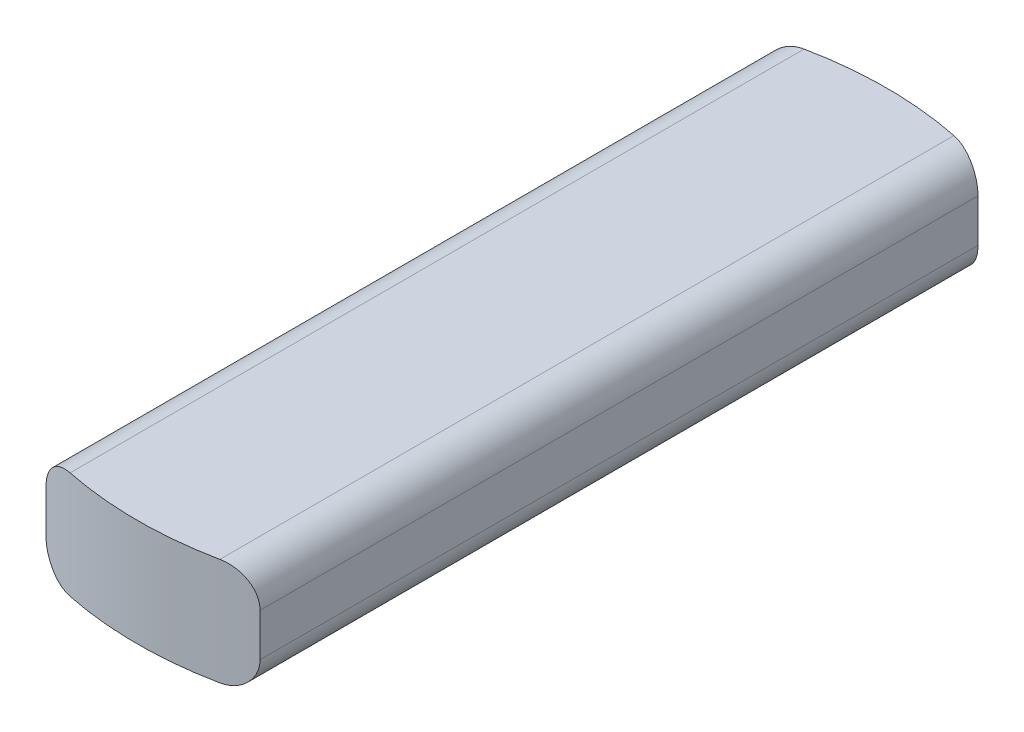
ISO-10303-21;
HEADER;
FILE_DESCRIPTION(('STEP AP214'),'2;1');
FILE_NAME('part.step','',(''),(''),'','','');
FILE_SCHEMA(('AUTOMOTIVE_DESIGN { 1 0 10303 214 1 1 1 1 }'));
ENDSEC;
DATA;
#1=APPLICATION_CONTEXT('core data for automotive mechanical design processes');
#2=APPLICATION_PROTOCOL_DEFINITION('international standard','automotive_design',2000,#1);
#3=PRODUCT_CONTEXT('',#1,'mechanical');
#4=PRODUCT('Part','Part','',(#3));
#5=PRODUCT_RELATED_PRODUCT_CATEGORY('part','',(#4));
#6=PRODUCT_DEFINITION_FORMATION('','',#4);
#7=PRODUCT_DEFINITION_CONTEXT('part definition',#1,'design');
#8=PRODUCT_DEFINITION('design','',#6,#7);
#9=PRODUCT_DEFINITION_SHAPE('','',#8);
#10=(LENGTH_UNIT() NAMED_UNIT(*) SI_UNIT(.MILLI.,.METRE.));
#11=(NAMED_UNIT(*) PLANE_ANGLE_UNIT() SI_UNIT($,.RADIAN.));
#12=(NAMED_UNIT(*) SI_UNIT($,.STERADIAN.) SOLID_ANGLE_UNIT());
#13=UNCERTAINTY_MEASURE_WITH_UNIT(LENGTH_MEASURE(1.E-05),#10,'distance_accuracy_value','');
#14=(GEOMETRIC_REPRESENTATION_CONTEXT(3) GLOBAL_UNCERTAINTY_ASSIGNED_CONTEXT((#13)) GLOBAL_UNIT_ASSIGNED_CONTEXT((#10,
#11,#12)) REPRESENTATION_CONTEXT('',''));
#15=CARTESIAN_POINT('',(0.,0.,0.));
#16=DIRECTION('',(0.,0.,1.));
#17=DIRECTION('',(1.,0.,0.));
#18=AXIS2_PLACEMENT_3D('',#15,#16,#17);
#19=CARTESIAN_POINT('',(-3.5,-1.,17.5));
#20=DIRECTION('',(0.,0.,-1.));
#21=DIRECTION('',(-1.,0.,0.));
#22=AXIS2_PLACEMENT_3D('',#19,#20,#21);
#23=CYLINDRICAL_SURFACE('',#22,1.5);
#24=CARTESIAN_POINT('',(-5.,-0.99999999999999,16.7705098312484));
#25=CARTESIAN_POINT('',(-5.00000065870343,-1.04104128220143,16.7705087352578));
#26=CARTESIAN_POINT('',(-4.998314497937,-1.08206230306019,16.7710124468364));
#27=CARTESIAN_POINT('',(-4.9915939494939,-1.16379838036076,16.7730142824674));
#28=CARTESIAN_POINT('',(-4.98656008171913,-1.20451348331913,16.7745122521104));
#29=CARTESIAN_POINT('',(-4.96651401385506,-1.32558078689147,16.780463179868));
#30=CARTESIAN_POINT('',(-4.94655699573606,-1.40510186332665,16.7863733472426));
#31=CARTESIAN_POINT('',(-4.89414164424874,-1.55948677231694,16.8017294613077));
#32=CARTESIAN_POINT('',(-4.86168375279418,-1.6343507693941,16.8111752830103));
#33=CARTESIAN_POINT('',(-4.78531529286935,-1.77752601402684,16.8330725078136));
#34=CARTESIAN_POINT('',(-4.74140205432498,-1.84583572879082,16.8455246115843));
#35=CARTESIAN_POINT('',(-4.64241461631817,-1.97554314239626,16.8730753815252));
#36=CARTESIAN_POINT('',(-4.58712661375274,-2.03676683410889,16.8882238579813));
#37=CARTESIAN_POINT('',(-4.46755173064513,-2.14916475273037,16.9202484541548));
#38=CARTESIAN_POINT('',(-4.40326216392505,-2.20033596886261,16.9371250891706));
#39=CARTESIAN_POINT('',(-4.26489872919042,-2.29310508933865,16.9725047058644));
#40=CARTESIAN_POINT('',(-4.19055211852855,-2.33428207337126,16.9910446625764));
#41=CARTESIAN_POINT('',(-4.03605696698123,-2.40349625128991,17.0284042303154));
#42=CARTESIAN_POINT('',(-3.9559105508048,-2.43153822922082,17.0472237369437));
#43=CARTESIAN_POINT('',(-3.81300166947133,-2.46833096854783,17.0796640213863));
#44=CARTESIAN_POINT('',(-3.75104101082652,-2.48018244353934,17.0933823894182));
#45=CARTESIAN_POINT('',(-3.62608733313874,-2.49601886003614,17.1203279805614));
#46=CARTESIAN_POINT('',(-3.56309545768596,-2.50001198962522,17.1335557007881));
#47=CARTESIAN_POINT('',(-3.49999999999999,-2.5,17.1464281994823));
#48=B_SPLINE_CURVE_WITH_KNOTS('',3,(#24,#25,#26,#27,#28,#29,#30,#31,#32,#33,#34,#35,#36,#37,#38,
#39,#40,#41,#42,#43,#44,#45,#46,#47),.UNSPECIFIED.,.F.,.F.,(4,2,2,2,2,2,2,2,2,2,2,4),(0.,
0.123046220415898,0.246073336104379,0.491396587958453,0.73671116827691,0.982082979011625,
1.23257571423747,1.48314335953641,1.74291920001327,2.00260035096508,2.19580727296565,
2.38881277421535),.UNSPECIFIED.);
#49=CARTESIAN_POINT('',(-5.,-0.99999999999999,16.7705098312484));
#50=VERTEX_POINT('',#49);
#51=CARTESIAN_POINT('',(-3.49999999999999,-2.5,17.1464281994823));
#52=VERTEX_POINT('',#51);
#53=EDGE_CURVE('E155',#50,#52,#48,.T.);
#54=ORIENTED_EDGE('',*,*,#53,.F.);
#55=DIRECTION('',(0.,0.,-1.));
#56=VECTOR('',#55,1.);
#57=CARTESIAN_POINT('',(-5.,-0.99999999999999,17.5));
#58=LINE('',#57,#56);
#59=CARTESIAN_POINT('',(-5.,-0.99999999999999,-16.7705098312484));
#60=VERTEX_POINT('',#59);
#61=EDGE_CURVE('E221',#50,#60,#58,.T.);
#62=ORIENTED_EDGE('',*,*,#61,.T.);
#63=CARTESIAN_POINT('',(-3.49999999999999,-2.5,-17.1464281994823));
#64=CARTESIAN_POINT('',(-3.54324647271187,-2.49999932347869,-17.137601506285));
#65=CARTESIAN_POINT('',(-3.58643723406876,-2.49812872026213,-17.1286136308124));
#66=CARTESIAN_POINT('',(-3.6724389631635,-2.49068092810015,-17.110380460051));
#67=CARTESIAN_POINT('',(-3.71524996722869,-2.48510409765068,-17.1011351897422));
#68=CARTESIAN_POINT('',(-3.84259775178756,-2.46288553774404,-17.0731357012091));
#69=CARTESIAN_POINT('',(-3.92617876783643,-2.44075552597619,-17.0540913202089));
#70=CARTESIAN_POINT('',(-4.08828308477007,-2.38251689366131,-17.0159600625531));
#71=CARTESIAN_POINT('',(-4.16680510086307,-2.34640473838125,-16.9968731763662));
#72=CARTESIAN_POINT('',(-4.31663684751532,-2.26116117394723,-16.9594401207682));
#73=CARTESIAN_POINT('',(-4.38794733376356,-2.21203113088194,-16.9410938738676));
#74=CARTESIAN_POINT('',(-4.52127649962827,-2.10202685320372,-16.9059995121423));
#75=CARTESIAN_POINT('',(-4.58329779878109,-2.04115594061732,-16.8892509472594));
#76=CARTESIAN_POINT('',(-4.69616925346195,-1.90923631660742,-16.8582154943923));
#77=CARTESIAN_POINT('',(-4.7470185270035,-1.83818680235523,-16.8439288007821));
#78=CARTESIAN_POINT('',(-4.83471052114633,-1.68977903608785,-16.8189657470596));
#79=CARTESIAN_POINT('',(-4.87186994605262,-1.61262146691293,-16.8082084818945));
#80=CARTESIAN_POINT('',(-4.932584363315,-1.45275924765054,-16.7904920237656));
#81=CARTESIAN_POINT('',(-4.95615501863049,-1.37006110712238,-16.7835284585433));
#82=CARTESIAN_POINT('',(-4.98163949538542,-1.23885376627147,-16.7759754861866));
#83=CARTESIAN_POINT('',(-4.98851965575464,-1.19133806094454,-16.7739294315573));
#84=CARTESIAN_POINT('',(-4.99769869833015,-1.09588997391677,-16.7711960417626));
#85=CARTESIAN_POINT('',(-5.00000350413977,-1.04795821177911,-16.7705069497792));
#86=CARTESIAN_POINT('',(-5.,-0.99999999999999,-16.7705098312484));
#87=B_SPLINE_CURVE_WITH_KNOTS('',3,(#63,#64,#65,#66,#67,#68,#69,#70,#71,#72,#73,#74,#75,#76,#77,
#78,#79,#80,#81,#82,#83,#84,#85,#86),.UNSPECIFIED.,.F.,.F.,(4,2,2,2,2,2,2,2,2,2,2,4),(0.,
0.132330565333009,0.26464833245755,0.52889249280884,0.793203498637663,1.05748677881919,
1.32169539063307,1.58592485316529,1.84358724598466,2.10095204995877,2.24490138297897,
2.38866422633939),.UNSPECIFIED.);
#88=CARTESIAN_POINT('',(-3.49999999999999,-2.5,-17.1464281994823));
#89=VERTEX_POINT('',#88);
#90=EDGE_CURVE('E56',#89,#60,#87,.T.);
#91=ORIENTED_EDGE('',*,*,#90,.F.);
#92=DIRECTION('',(0.,0.,-1.));
#93=VECTOR('',#92,1.);
#94=CARTESIAN_POINT('',(-3.49999999999999,-2.5,17.5));
#95=LINE('',#94,#93);
#96=EDGE_CURVE('E12',#52,#89,#95,.T.);
#97=ORIENTED_EDGE('',*,*,#96,.F.);
#98=EDGE_LOOP('',(#54,#62,#91,#97));
#99=FACE_BOUND('',#98,.T.);
#100=ADVANCED_FACE('F33',(#99),#23,.T.);
#101=CARTESIAN_POINT('',(-3.49999999999999,-2.5,17.5));
#102=DIRECTION('',(0.,1.,0.));
#103=DIRECTION('',(0.,0.,1.));
#104=AXIS2_PLACEMENT_3D('',#101,#102,#103);
#105=PLANE('',#104);
#106=CARTESIAN_POINT('',(0.,-2.5,0.));
#107=DIRECTION('',(0.,1.,0.));
#108=DIRECTION('',(0.,0.,1.));
#109=AXIS2_PLACEMENT_3D('',#106,#107,#108);
#110=CIRCLE('',#109,17.5);
#111=CARTESIAN_POINT('',(3.5,-2.5,-17.1464281994823));
#112=VERTEX_POINT('',#111);
#113=EDGE_CURVE('E115',#112,#89,#110,.T.);
#114=ORIENTED_EDGE('',*,*,#113,.F.);
#115=DIRECTION('',(0.,0.,-1.));
#116=VECTOR('',#115,1.);
#117=CARTESIAN_POINT('',(3.49999999999999,-2.5,17.5));
#118=LINE('',#117,#116);
#119=CARTESIAN_POINT('',(3.5,-2.5,17.1464281994823));
#120=VERTEX_POINT('',#119);
#121=EDGE_CURVE('E41',#120,#112,#118,.T.);
#122=ORIENTED_EDGE('',*,*,#121,.F.);
#123=EDGE_CURVE('E141',#52,#120,#110,.T.);
#124=ORIENTED_EDGE('',*,*,#123,.F.);
#125=ORIENTED_EDGE('',*,*,#96,.T.);
#126=EDGE_LOOP('',(#114,#122,#124,#125));
#127=FACE_BOUND('',#126,.T.);
#128=ADVANCED_FACE('F140',(#127),#105,.F.);
#129=CARTESIAN_POINT('',(3.5,-1.,17.5));
#130=DIRECTION('',(0.,0.,-1.));
#131=DIRECTION('',(-1.,0.,0.));
#132=AXIS2_PLACEMENT_3D('',#129,#130,#131);
#133=CYLINDRICAL_SURFACE('',#132,1.5);
#134=CARTESIAN_POINT('',(3.49999999999999,-2.5,17.1464281994823));
#135=CARTESIAN_POINT('',(3.54324647271187,-2.49999932347869,17.137601506285));
#136=CARTESIAN_POINT('',(3.58643723406876,-2.49812872026213,17.1286136308124));
#137=CARTESIAN_POINT('',(3.6724389631635,-2.49068092810015,17.110380460051));
#138=CARTESIAN_POINT('',(3.71524996722869,-2.48510409765068,17.1011351897422));
#139=CARTESIAN_POINT('',(3.84259775178756,-2.46288553774404,17.0731357012091));
#140=CARTESIAN_POINT('',(3.92617876783643,-2.44075552597618,17.0540913202089));
#141=CARTESIAN_POINT('',(4.08828308477007,-2.38251689366131,17.0159600625531));
#142=CARTESIAN_POINT('',(4.16680510086307,-2.34640473838125,16.9968731763662));
#143=CARTESIAN_POINT('',(4.31663684751532,-2.26116117394723,16.9594401207682));
#144=CARTESIAN_POINT('',(4.38794733376355,-2.21203113088194,16.9410938738676));
#145=CARTESIAN_POINT('',(4.52127649962827,-2.10202685320372,16.9059995121423));
#146=CARTESIAN_POINT('',(4.58329779878109,-2.04115594061732,16.8892509472594));
#147=CARTESIAN_POINT('',(4.69616925346195,-1.90923631660742,16.8582154943923));
#148=CARTESIAN_POINT('',(4.7470185270035,-1.83818680235523,16.8439288007821));
#149=CARTESIAN_POINT('',(4.83471052114633,-1.68977903608785,16.8189657470596));
#150=CARTESIAN_POINT('',(4.87186994605262,-1.61262146691292,16.8082084818945));
#151=CARTESIAN_POINT('',(4.93258436331499,-1.45275924765054,16.7904920237656));
#152=CARTESIAN_POINT('',(4.95615501863049,-1.37006110712238,16.7835284585433));
#153=CARTESIAN_POINT('',(4.98163949538542,-1.23885376627147,16.7759754861866));
#154=CARTESIAN_POINT('',(4.98851965575463,-1.19133806094455,16.7739294315573));
#155=CARTESIAN_POINT('',(4.99769869833015,-1.09588997391678,16.7711960417626));
#156=CARTESIAN_POINT('',(5.00000350413977,-1.04795821177912,16.7705069497792));
#157=CARTESIAN_POINT('',(5.,-1.,16.7705098312484));
#158=B_SPLINE_CURVE_WITH_KNOTS('',3,(#134,#135,#136,#137,#138,#139,#140,#141,#142,#143,#144,
#145,#146,#147,#148,#149,#150,#151,#152,#153,#154,#155,#156,#157),.UNSPECIFIED.,.F.,.F.,(4,2,2,
2,2,2,2,2,2,2,2,4),(0.,0.13233056533301,0.26464833245755,0.52889249280884,0.793203498637662,
1.05748677881919,1.32169539063307,1.58592485316529,1.84358724598467,2.10095204995878,
2.24490138297896,2.38866422633937),.UNSPECIFIED.);
#159=CARTESIAN_POINT('',(5.,-1.,16.7705098312484));
#160=VERTEX_POINT('',#159);
#161=EDGE_CURVE('E137',#120,#160,#158,.T.);
#162=ORIENTED_EDGE('',*,*,#161,.F.);
#163=ORIENTED_EDGE('',*,*,#121,.T.);
#164=CARTESIAN_POINT('',(5.,-1.,-16.7705098312484));
#165=CARTESIAN_POINT('',(5.00000065870343,-1.04104128220144,-16.7705087352578));
#166=CARTESIAN_POINT('',(4.998314497937,-1.0820623030602,-16.7710124468364));
#167=CARTESIAN_POINT('',(4.9915939494939,-1.16379838036077,-16.7730142824674));
#168=CARTESIAN_POINT('',(4.98656008171912,-1.20451348331914,-16.7745122521104));
#169=CARTESIAN_POINT('',(4.96651401385506,-1.32558078689148,-16.780463179868));
#170=CARTESIAN_POINT('',(4.94655699573606,-1.40510186332666,-16.7863733472426));
#171=CARTESIAN_POINT('',(4.89414164424874,-1.55948677231695,-16.8017294613077));
#172=CARTESIAN_POINT('',(4.86168375279417,-1.63435076939411,-16.8111752830103));
#173=CARTESIAN_POINT('',(4.78531529286935,-1.77752601402685,-16.8330725078136));
#174=CARTESIAN_POINT('',(4.74140205432497,-1.84583572879083,-16.8455246115843));
#175=CARTESIAN_POINT('',(4.64241461631816,-1.97554314239627,-16.8730753815252));
#176=CARTESIAN_POINT('',(4.58712661375273,-2.03676683410889,-16.8882238579813));
#177=CARTESIAN_POINT('',(4.46755173064512,-2.14916475273038,-16.9202484541548));
#178=CARTESIAN_POINT('',(4.40326216392504,-2.20033596886262,-16.9371250891706));
#179=CARTESIAN_POINT('',(4.26489872919041,-2.29310508933866,-16.9725047058644));
#180=CARTESIAN_POINT('',(4.19055211852854,-2.33428207337126,-16.9910446625764));
#181=CARTESIAN_POINT('',(4.03605696698122,-2.40349625128992,-17.0284042303154));
#182=CARTESIAN_POINT('',(3.95591055080479,-2.43153822922083,-17.0472237369437));
#183=CARTESIAN_POINT('',(3.81300166947132,-2.46833096854783,-17.0796640213863));
#184=CARTESIAN_POINT('',(3.75104101082651,-2.48018244353934,-17.0933823894182));
#185=CARTESIAN_POINT('',(3.62608733313873,-2.49601886003614,-17.1203279805614));
#186=CARTESIAN_POINT('',(3.56309545768596,-2.50001198962522,-17.1335557007881));
#187=CARTESIAN_POINT('',(3.49999999999999,-2.5,-17.1464281994823));
#188=B_SPLINE_CURVE_WITH_KNOTS('',3,(#164,#165,#166,#167,#168,#169,#170,#171,#172,#173,#174,
#175,#176,#177,#178,#179,#180,#181,#182,#183,#184,#185,#186,#187),.UNSPECIFIED.,.F.,.F.,(4,2,2,
2,2,2,2,2,2,2,2,4),(0.,0.123046220415898,0.246073336104379,0.491396587958453,0.73671116827691,
0.982082979011626,1.23257571423747,1.48314335953641,1.74291920001327,2.00260035096508,
2.19580727296565,2.38881277421534),.UNSPECIFIED.);
#189=CARTESIAN_POINT('',(5.,-1.,-16.7705098312484));
#190=VERTEX_POINT('',#189);
#191=EDGE_CURVE('E106',#190,#112,#188,.T.);
#192=ORIENTED_EDGE('',*,*,#191,.F.);
#193=DIRECTION('',(0.,0.,-1.));
#194=VECTOR('',#193,1.);
#195=CARTESIAN_POINT('',(5.,-1.,17.5));
#196=LINE('',#195,#194);
#197=EDGE_CURVE('E123',#160,#190,#196,.T.);
#198=ORIENTED_EDGE('',*,*,#197,.F.);
#199=EDGE_LOOP('',(#162,#163,#192,#198));
#200=FACE_BOUND('',#199,.T.);
#201=ADVANCED_FACE('F135',(#200),#133,.T.);
#202=CARTESIAN_POINT('',(5.,-0.99999999999999,17.5));
#203=DIRECTION('',(-1.,0.,0.));
#204=DIRECTION('',(0.,0.,1.));
#205=AXIS2_PLACEMENT_3D('',#202,#203,#204);
#206=PLANE('',#205);
#207=DIRECTION('',(0.,1.,0.));
#208=VECTOR('',#207,1.);
#209=CARTESIAN_POINT('',(5.,-2.5,16.7705098312484));
#210=LINE('',#209,#208);
#211=CARTESIAN_POINT('',(5.,0.999999999999989,16.7705098312484));
#212=VERTEX_POINT('',#211);
#213=EDGE_CURVE('E101',#160,#212,#210,.T.);
#214=ORIENTED_EDGE('',*,*,#213,.F.);
#215=ORIENTED_EDGE('',*,*,#197,.T.);
#216=DIRECTION('',(0.,1.,0.));
#217=VECTOR('',#216,1.);
#218=CARTESIAN_POINT('',(5.,-2.5,-16.7705098312484));
#219=LINE('',#218,#217);
#220=CARTESIAN_POINT('',(5.,0.999999999999989,-16.7705098312484));
#221=VERTEX_POINT('',#220);
#222=EDGE_CURVE('E300',#221,#190,#219,.F.);
#223=ORIENTED_EDGE('',*,*,#222,.F.);
#224=DIRECTION('',(0.,0.,-1.));
#225=VECTOR('',#224,1.);
#226=CARTESIAN_POINT('',(5.,0.999999999999989,17.5));
#227=LINE('',#226,#225);
#228=EDGE_CURVE('E121',#212,#221,#227,.T.);
#229=ORIENTED_EDGE('',*,*,#228,.F.);
#230=EDGE_LOOP('',(#214,#215,#223,#229));
#231=FACE_BOUND('',#230,.T.);
#232=ADVANCED_FACE('F209',(#231),#206,.F.);
#233=CARTESIAN_POINT('',(3.5,1.,17.5));
#234=DIRECTION('',(0.,0.,-1.));
#235=DIRECTION('',(-1.,0.,0.));
#236=AXIS2_PLACEMENT_3D('',#233,#234,#235);
#237=CYLINDRICAL_SURFACE('',#236,1.5);
#238=CARTESIAN_POINT('',(5.,0.999999999999989,16.7705098312484));
#239=CARTESIAN_POINT('',(5.00000065870343,1.04104128220143,16.7705087352578));
#240=CARTESIAN_POINT('',(4.998314497937,1.08206230306019,16.7710124468364));
#241=CARTESIAN_POINT('',(4.9915939494939,1.16379838036076,16.7730142824674));
#242=CARTESIAN_POINT('',(4.98656008171913,1.20451348331913,16.7745122521104));
#243=CARTESIAN_POINT('',(4.96651401385506,1.32558078689147,16.780463179868));
#244=CARTESIAN_POINT('',(4.94655699573606,1.40510186332665,16.7863733472426));
#245=CARTESIAN_POINT('',(4.89414164424874,1.55948677231694,16.8017294613077));
#246=CARTESIAN_POINT('',(4.86168375279417,1.6343507693941,16.8111752830103));
#247=CARTESIAN_POINT('',(4.78531529286935,1.77752601402684,16.8330725078136));
#248=CARTESIAN_POINT('',(4.74140205432498,1.84583572879082,16.8455246115843));
#249=CARTESIAN_POINT('',(4.64241461631817,1.97554314239626,16.8730753815252));
#250=CARTESIAN_POINT('',(4.58712661375274,2.03676683410889,16.8882238579813));
#251=CARTESIAN_POINT('',(4.46755173064513,2.14916475273037,16.9202484541548));
#252=CARTESIAN_POINT('',(4.40326216392505,2.20033596886261,16.9371250891706));
#253=CARTESIAN_POINT('',(4.26489872919042,2.29310508933865,16.9725047058644));
#254=CARTESIAN_POINT('',(4.19055211852855,2.33428207337126,16.9910446625764));
#255=CARTESIAN_POINT('',(4.03605696698123,2.40349625128991,17.0284042303154));
#256=CARTESIAN_POINT('',(3.9559105508048,2.43153822922082,17.0472237369437));
#257=CARTESIAN_POINT('',(3.81300166947133,2.46833096854783,17.0796640213863));
#258=CARTESIAN_POINT('',(3.75104101082652,2.48018244353934,17.0933823894182));
#259=CARTESIAN_POINT('',(3.62608733313874,2.49601886003614,17.1203279805614));
#260=CARTESIAN_POINT('',(3.56309545768596,2.50001198962522,17.1335557007881));
#261=CARTESIAN_POINT('',(3.49999999999999,2.5,17.1464281994823));
#262=B_SPLINE_CURVE_WITH_KNOTS('',3,(#238,#239,#240,#241,#242,#243,#244,#245,#246,#247,#248,
#249,#250,#251,#252,#253,#254,#255,#256,#257,#258,#259,#260,#261),.UNSPECIFIED.,.F.,.F.,(4,2,2,
2,2,2,2,2,2,2,2,4),(0.,0.123046220415898,0.24607333610438,0.491396587958454,0.736711168276911,
0.982082979011626,1.23257571423748,1.48314335953641,1.74291920001327,2.00260035096508,
2.19580727296565,2.38881277421535),.UNSPECIFIED.);
#263=CARTESIAN_POINT('',(3.49999999999999,2.5,17.1464281994823));
#264=VERTEX_POINT('',#263);
#265=EDGE_CURVE('E96',#212,#264,#262,.T.);
#266=ORIENTED_EDGE('',*,*,#265,.F.);
#267=ORIENTED_EDGE('',*,*,#228,.T.);
#268=CARTESIAN_POINT('',(3.49999999999999,2.5,-17.1464281994823));
#269=CARTESIAN_POINT('',(3.54324647271187,2.49999932347869,-17.137601506285));
#270=CARTESIAN_POINT('',(3.58643723406876,2.49812872026213,-17.1286136308124));
#271=CARTESIAN_POINT('',(3.6724389631635,2.49068092810015,-17.110380460051));
#272=CARTESIAN_POINT('',(3.71524996722869,2.48510409765068,-17.1011351897422));
#273=CARTESIAN_POINT('',(3.84259775178756,2.46288553774404,-17.0731357012091));
#274=CARTESIAN_POINT('',(3.92617876783643,2.44075552597618,-17.0540913202089));
#275=CARTESIAN_POINT('',(4.08828308477007,2.38251689366131,-17.0159600625531));
#276=CARTESIAN_POINT('',(4.16680510086307,2.34640473838125,-16.9968731763662));
#277=CARTESIAN_POINT('',(4.31663684751532,2.26116117394723,-16.9594401207682));
#278=CARTESIAN_POINT('',(4.38794733376355,2.21203113088194,-16.9410938738676));
#279=CARTESIAN_POINT('',(4.52127649962827,2.10202685320372,-16.9059995121423));
#280=CARTESIAN_POINT('',(4.58329779878109,2.04115594061732,-16.8892509472594));
#281=CARTESIAN_POINT('',(4.69616925346194,1.90923631660742,-16.8582154943923));
#282=CARTESIAN_POINT('',(4.7470185270035,1.83818680235523,-16.8439288007821));
#283=CARTESIAN_POINT('',(4.83471052114633,1.68977903608785,-16.8189657470596));
#284=CARTESIAN_POINT('',(4.87186994605262,1.61262146691293,-16.8082084818945));
#285=CARTESIAN_POINT('',(4.93258436331499,1.45275924765054,-16.7904920237656));
#286=CARTESIAN_POINT('',(4.95615501863049,1.37006110712238,-16.7835284585433));
#287=CARTESIAN_POINT('',(4.98163949538542,1.23885376627147,-16.7759754861866));
#288=CARTESIAN_POINT('',(4.98851965575463,1.19133806094454,-16.7739294315573));
#289=CARTESIAN_POINT('',(4.99769869833015,1.09588997391677,-16.7711960417626));
#290=CARTESIAN_POINT('',(5.00000350413977,1.04795821177911,-16.7705069497792));
#291=CARTESIAN_POINT('',(5.,0.999999999999989,-16.7705098312484));
#292=B_SPLINE_CURVE_WITH_KNOTS('',3,(#268,#269,#270,#271,#272,#273,#274,#275,#276,#277,#278,
#279,#280,#281,#282,#283,#284,#285,#286,#287,#288,#289,#290,#291),.UNSPECIFIED.,.F.,.F.,(4,2,2,
2,2,2,2,2,2,2,2,4),(0.,0.13233056533301,0.26464833245755,0.52889249280884,0.793203498637663,
1.05748677881919,1.32169539063307,1.58592485316529,1.84358724598466,2.10095204995878,
2.24490138297897,2.38866422633939),.UNSPECIFIED.);
#293=CARTESIAN_POINT('',(3.49999999999999,2.5,-17.1464281994823));
#294=VERTEX_POINT('',#293);
#295=EDGE_CURVE('E120',#294,#221,#292,.T.);
#296=ORIENTED_EDGE('',*,*,#295,.F.);
#297=DIRECTION('',(0.,0.,-1.));
#298=VECTOR('',#297,1.);
#299=CARTESIAN_POINT('',(3.49999999999999,2.5,17.5));
#300=LINE('',#299,#298);
#301=EDGE_CURVE('E112',#264,#294,#300,.T.);
#302=ORIENTED_EDGE('',*,*,#301,.F.);
#303=EDGE_LOOP('',(#266,#267,#296,#302));
#304=FACE_BOUND('',#303,.T.);
#305=ADVANCED_FACE('F119',(#304),#237,.T.);
#306=CARTESIAN_POINT('',(-3.49999999999999,2.5,17.5));
#307=DIRECTION('',(0.,-1.,0.));
#308=DIRECTION('',(0.,0.,-1.));
#309=AXIS2_PLACEMENT_3D('',#306,#307,#308);
#310=PLANE('',#309);
#311=CARTESIAN_POINT('',(0.,2.5,0.));
#312=DIRECTION('',(0.,1.,0.));
#313=DIRECTION('',(0.,0.,1.));
#314=AXIS2_PLACEMENT_3D('',#311,#312,#313);
#315=CIRCLE('',#314,17.5);
#316=CARTESIAN_POINT('',(-3.5,2.5,17.1464281994823));
#317=VERTEX_POINT('',#316);
#318=EDGE_CURVE('E99',#317,#264,#315,.T.);
#319=ORIENTED_EDGE('',*,*,#318,.T.);
#320=ORIENTED_EDGE('',*,*,#301,.T.);
#321=CARTESIAN_POINT('',(-3.5,2.5,-17.1464281994823));
#322=VERTEX_POINT('',#321);
#323=EDGE_CURVE('E116',#294,#322,#315,.T.);
#324=ORIENTED_EDGE('',*,*,#323,.T.);
#325=DIRECTION('',(0.,0.,-1.));
#326=VECTOR('',#325,1.);
#327=CARTESIAN_POINT('',(-3.49999999999999,2.5,17.5));
#328=LINE('',#327,#326);
#329=EDGE_CURVE('E114',#317,#322,#328,.T.);
#330=ORIENTED_EDGE('',*,*,#329,.F.);
#331=EDGE_LOOP('',(#319,#320,#324,#330));
#332=FACE_BOUND('',#331,.T.);
#333=ADVANCED_FACE('F111',(#332),#310,.F.);
#334=CARTESIAN_POINT('',(-3.5,1.,17.5));
#335=DIRECTION('',(0.,0.,-1.));
#336=DIRECTION('',(-1.,0.,0.));
#337=AXIS2_PLACEMENT_3D('',#334,#335,#336);
#338=CYLINDRICAL_SURFACE('',#337,1.5);
#339=CARTESIAN_POINT('',(-3.49999999999999,2.5,17.1464281994823));
#340=CARTESIAN_POINT('',(-3.54324647271187,2.49999932347869,17.137601506285));
#341=CARTESIAN_POINT('',(-3.58643723406876,2.49812872026213,17.1286136308124));
#342=CARTESIAN_POINT('',(-3.6724389631635,2.49068092810015,17.110380460051));
#343=CARTESIAN_POINT('',(-3.71524996722869,2.48510409765068,17.1011351897422));
#344=CARTESIAN_POINT('',(-3.84259775178756,2.46288553774404,17.0731357012091));
#345=CARTESIAN_POINT('',(-3.92617876783643,2.44075552597618,17.0540913202089));
#346=CARTESIAN_POINT('',(-4.08828308477007,2.38251689366131,17.0159600625531));
#347=CARTESIAN_POINT('',(-4.16680510086307,2.34640473838124,16.9968731763662));
#348=CARTESIAN_POINT('',(-4.31663684751532,2.26116117394723,16.9594401207682));
#349=CARTESIAN_POINT('',(-4.38794733376356,2.21203113088194,16.9410938738676));
#350=CARTESIAN_POINT('',(-4.52127649962827,2.10202685320372,16.9059995121423));
#351=CARTESIAN_POINT('',(-4.58329779878109,2.04115594061732,16.8892509472594));
#352=CARTESIAN_POINT('',(-4.69616925346195,1.90923631660742,16.8582154943923));
#353=CARTESIAN_POINT('',(-4.7470185270035,1.83818680235523,16.8439288007821));
#354=CARTESIAN_POINT('',(-4.83471052114633,1.68977903608785,16.8189657470596));
#355=CARTESIAN_POINT('',(-4.87186994605262,1.61262146691292,16.8082084818945));
#356=CARTESIAN_POINT('',(-4.932584363315,1.45275924765054,16.7904920237656));
#357=CARTESIAN_POINT('',(-4.95615501863049,1.37006110712238,16.7835284585433));
#358=CARTESIAN_POINT('',(-4.98163949538542,1.23885376627147,16.7759754861866));
#359=CARTESIAN_POINT('',(-4.98851965575464,1.19133806094454,16.7739294315573));
#360=CARTESIAN_POINT('',(-4.99769869833015,1.09588997391677,16.7711960417626));
#361=CARTESIAN_POINT('',(-5.00000350413977,1.04795821177911,16.7705069497792));
#362=CARTESIAN_POINT('',(-5.,0.999999999999989,16.7705098312484));
#363=B_SPLINE_CURVE_WITH_KNOTS('',3,(#339,#340,#341,#342,#343,#344,#345,#346,#347,#348,#349,
#350,#351,#352,#353,#354,#355,#356,#357,#358,#359,#360,#361,#362),.UNSPECIFIED.,.F.,.F.,(4,2,2,
2,2,2,2,2,2,2,2,4),(0.,0.13233056533301,0.264648332457551,0.528892492808841,0.793203498637664,
1.05748677881919,1.32169539063307,1.58592485316529,1.84358724598467,2.10095204995878,
2.24490138297897,2.38866422633939),.UNSPECIFIED.);
#364=CARTESIAN_POINT('',(-5.,0.999999999999989,16.7705098312484));
#365=VERTEX_POINT('',#364);
#366=EDGE_CURVE('E48',#317,#365,#363,.T.);
#367=ORIENTED_EDGE('',*,*,#366,.F.);
#368=ORIENTED_EDGE('',*,*,#329,.T.);
#369=CARTESIAN_POINT('',(-5.,0.999999999999989,-16.7705098312484));
#370=CARTESIAN_POINT('',(-5.00000065870343,1.04104128220143,-16.7705087352578));
#371=CARTESIAN_POINT('',(-4.998314497937,1.08206230306019,-16.7710124468364));
#372=CARTESIAN_POINT('',(-4.9915939494939,1.16379838036076,-16.7730142824674));
#373=CARTESIAN_POINT('',(-4.98656008171913,1.20451348331913,-16.7745122521104));
#374=CARTESIAN_POINT('',(-4.96651401385506,1.32558078689147,-16.780463179868));
#375=CARTESIAN_POINT('',(-4.94655699573606,1.40510186332665,-16.7863733472426));
#376=CARTESIAN_POINT('',(-4.89414164424874,1.55948677231694,-16.8017294613077));
#377=CARTESIAN_POINT('',(-4.86168375279418,1.6343507693941,-16.8111752830103));
#378=CARTESIAN_POINT('',(-4.78531529286935,1.77752601402684,-16.8330725078136));
#379=CARTESIAN_POINT('',(-4.74140205432498,1.84583572879082,-16.8455246115843));
#380=CARTESIAN_POINT('',(-4.64241461631817,1.97554314239626,-16.8730753815252));
#381=CARTESIAN_POINT('',(-4.58712661375274,2.03676683410889,-16.8882238579813));
#382=CARTESIAN_POINT('',(-4.46755173064513,2.14916475273037,-16.9202484541548));
#383=CARTESIAN_POINT('',(-4.40326216392505,2.20033596886261,-16.9371250891706));
#384=CARTESIAN_POINT('',(-4.26489872919042,2.29310508933865,-16.9725047058644));
#385=CARTESIAN_POINT('',(-4.19055211852855,2.33428207337126,-16.9910446625764));
#386=CARTESIAN_POINT('',(-4.03605696698123,2.40349625128991,-17.0284042303154));
#387=CARTESIAN_POINT('',(-3.9559105508048,2.43153822922082,-17.0472237369437));
#388=CARTESIAN_POINT('',(-3.81300166947133,2.46833096854783,-17.0796640213863));
#389=CARTESIAN_POINT('',(-3.75104101082652,2.48018244353934,-17.0933823894182));
#390=CARTESIAN_POINT('',(-3.62608733313874,2.49601886003614,-17.1203279805614));
#391=CARTESIAN_POINT('',(-3.56309545768596,2.50001198962522,-17.1335557007881));
#392=CARTESIAN_POINT('',(-3.49999999999999,2.5,-17.1464281994823));
#393=B_SPLINE_CURVE_WITH_KNOTS('',3,(#369,#370,#371,#372,#373,#374,#375,#376,#377,#378,#379,
#380,#381,#382,#383,#384,#385,#386,#387,#388,#389,#390,#391,#392),.UNSPECIFIED.,.F.,.F.,(4,2,2,
2,2,2,2,2,2,2,2,4),(0.,0.123046220415898,0.246073336104379,0.491396587958454,0.736711168276911,
0.982082979011626,1.23257571423748,1.48314335953641,1.74291920001327,2.00260035096508,
2.19580727296565,2.38881277421535),.UNSPECIFIED.);
#394=CARTESIAN_POINT('',(-5.,0.999999999999989,-16.7705098312484));
#395=VERTEX_POINT('',#394);
#396=EDGE_CURVE('E176',#395,#322,#393,.T.);
#397=ORIENTED_EDGE('',*,*,#396,.F.);
#398=DIRECTION('',(0.,0.,-1.));
#399=VECTOR('',#398,1.);
#400=CARTESIAN_POINT('',(-5.,0.999999999999989,17.5));
#401=LINE('',#400,#399);
#402=EDGE_CURVE('E125',#365,#395,#401,.T.);
#403=ORIENTED_EDGE('',*,*,#402,.F.);
#404=EDGE_LOOP('',(#367,#368,#397,#403));
#405=FACE_BOUND('',#404,.T.);
#406=ADVANCED_FACE('F161',(#405),#338,.T.);
#407=CARTESIAN_POINT('',(-5.,-0.99999999999999,17.5));
#408=DIRECTION('',(1.,0.,0.));
#409=DIRECTION('',(0.,0.,-1.));
#410=AXIS2_PLACEMENT_3D('',#407,#408,#409);
#411=PLANE('',#410);
#412=DIRECTION('',(0.,1.,0.));
#413=VECTOR('',#412,1.);
#414=CARTESIAN_POINT('',(-5.,-2.5,-16.7705098312484));
#415=LINE('',#414,#413);
#416=EDGE_CURVE('E227',#60,#395,#415,.T.);
#417=ORIENTED_EDGE('',*,*,#416,.F.);
#418=ORIENTED_EDGE('',*,*,#61,.F.);
#419=DIRECTION('',(0.,1.,0.));
#420=VECTOR('',#419,1.);
#421=CARTESIAN_POINT('',(-5.,-2.5,16.7705098312484));
#422=LINE('',#421,#420);
#423=EDGE_CURVE('E145',#365,#50,#422,.F.);
#424=ORIENTED_EDGE('',*,*,#423,.F.);
#425=ORIENTED_EDGE('',*,*,#402,.T.);
#426=EDGE_LOOP('',(#417,#418,#424,#425));
#427=FACE_BOUND('',#426,.T.);
#428=ADVANCED_FACE('F168',(#427),#411,.F.);
#429=CARTESIAN_POINT('',(0.,-2.5,0.));
#430=DIRECTION('',(0.,1.,0.));
#431=DIRECTION('',(0.,0.,1.));
#432=AXIS2_PLACEMENT_3D('',#429,#430,#431);
#433=CYLINDRICAL_SURFACE('',#432,17.5);
#434=ORIENTED_EDGE('',*,*,#161,.T.);
#435=ORIENTED_EDGE('',*,*,#213,.T.);
#436=ORIENTED_EDGE('',*,*,#265,.T.);
#437=ORIENTED_EDGE('',*,*,#318,.F.);
#438=ORIENTED_EDGE('',*,*,#366,.T.);
#439=ORIENTED_EDGE('',*,*,#423,.T.);
#440=ORIENTED_EDGE('',*,*,#53,.T.);
#441=ORIENTED_EDGE('',*,*,#123,.T.);
#442=EDGE_LOOP('',(#434,#435,#436,#437,#438,#439,#440,#441));
#443=FACE_BOUND('',#442,.T.);
#444=ADVANCED_FACE('F98',(#443),#433,.T.);
#445=ORIENTED_EDGE('',*,*,#191,.T.);
#446=ORIENTED_EDGE('',*,*,#113,.T.);
#447=ORIENTED_EDGE('',*,*,#90,.T.);
#448=ORIENTED_EDGE('',*,*,#416,.T.);
#449=ORIENTED_EDGE('',*,*,#396,.T.);
#450=ORIENTED_EDGE('',*,*,#323,.F.);
#451=ORIENTED_EDGE('',*,*,#295,.T.);
#452=ORIENTED_EDGE('',*,*,#222,.T.);
#453=EDGE_LOOP('',(#445,#446,#447,#448,#449,#450,#451,#452));
#454=FACE_BOUND('',#453,.T.);
#455=ADVANCED_FACE('F167',(#454),#433,.T.);
#456=CLOSED_SHELL('',(#100,#128,#201,#232,#305,#333,#406,#428,#444,#455));
#457=MANIFOLD_SOLID_BREP('B2',#456);
#458=ADVANCED_BREP_SHAPE_REPRESENTATION('',(#18,#457),#14);
#459=SHAPE_DEFINITION_REPRESENTATION(#9,#458);
ENDSEC;
END-ISO-10303-21;
